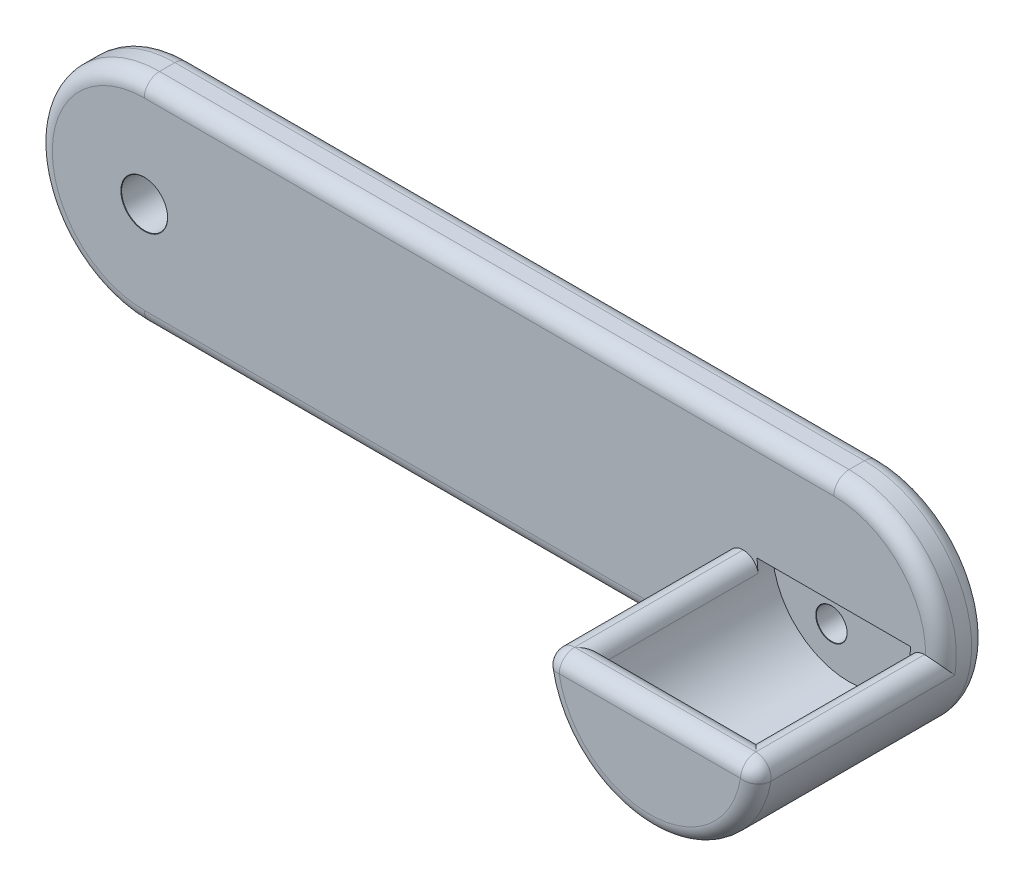
ISO-10303-21;
HEADER;
FILE_DESCRIPTION(('STEP AP214'),'2;1');
FILE_NAME('part.step','',(''),(''),'','','');
FILE_SCHEMA(('AUTOMOTIVE_DESIGN { 1 0 10303 214 1 1 1 1 }'));
ENDSEC;
DATA;
#1=APPLICATION_CONTEXT('core data for automotive mechanical design processes');
#2=APPLICATION_PROTOCOL_DEFINITION('international standard','automotive_design',2000,#1);
#3=PRODUCT_CONTEXT('',#1,'mechanical');
#4=PRODUCT('Part','Part','',(#3));
#5=PRODUCT_RELATED_PRODUCT_CATEGORY('part','',(#4));
#6=PRODUCT_DEFINITION_FORMATION('','',#4);
#7=PRODUCT_DEFINITION_CONTEXT('part definition',#1,'design');
#8=PRODUCT_DEFINITION('design','',#6,#7);
#9=PRODUCT_DEFINITION_SHAPE('','',#8);
#10=(LENGTH_UNIT() NAMED_UNIT(*) SI_UNIT(.MILLI.,.METRE.));
#11=(NAMED_UNIT(*) PLANE_ANGLE_UNIT() SI_UNIT($,.RADIAN.));
#12=(NAMED_UNIT(*) SI_UNIT($,.STERADIAN.) SOLID_ANGLE_UNIT());
#13=UNCERTAINTY_MEASURE_WITH_UNIT(LENGTH_MEASURE(1.E-05),#10,'distance_accuracy_value','');
#14=(GEOMETRIC_REPRESENTATION_CONTEXT(3) GLOBAL_UNCERTAINTY_ASSIGNED_CONTEXT((#13)) GLOBAL_UNIT_ASSIGNED_CONTEXT((#10,
#11,#12)) REPRESENTATION_CONTEXT('',''));
#15=CARTESIAN_POINT('',(0.,0.,0.));
#16=DIRECTION('',(0.,0.,1.));
#17=DIRECTION('',(1.,0.,0.));
#18=AXIS2_PLACEMENT_3D('',#15,#16,#17);
#19=CARTESIAN_POINT('',(0.,0.,3.));
#20=DIRECTION('',(0.,0.,-1.));
#21=DIRECTION('',(-1.,0.,0.));
#22=AXIS2_PLACEMENT_3D('',#19,#20,#21);
#23=CYLINDRICAL_SURFACE('',#22,7.);
#24=DIRECTION('',(0.,0.,-1.));
#25=VECTOR('',#24,1.);
#26=CARTESIAN_POINT('',(0.,7.,3.));
#27=LINE('',#26,#25);
#28=CARTESIAN_POINT('',(0.,7.,2.));
#29=VERTEX_POINT('',#28);
#30=CARTESIAN_POINT('',(0.,7.,1.));
#31=VERTEX_POINT('',#30);
#32=EDGE_CURVE('E423',#29,#31,#27,.T.);
#33=ORIENTED_EDGE('',*,*,#32,.T.);
#34=CARTESIAN_POINT('',(0.,0.,1.));
#35=DIRECTION('',(0.,0.,1.));
#36=DIRECTION('',(1.,0.,0.));
#37=AXIS2_PLACEMENT_3D('',#34,#35,#36);
#38=CIRCLE('',#37,7.);
#39=CARTESIAN_POINT('',(0.,-7.,1.));
#40=VERTEX_POINT('',#39);
#41=EDGE_CURVE('E477',#31,#40,#38,.T.);
#42=ORIENTED_EDGE('',*,*,#41,.T.);
#43=DIRECTION('',(0.,0.,-1.));
#44=VECTOR('',#43,1.);
#45=CARTESIAN_POINT('',(0.,-7.,3.));
#46=LINE('',#45,#44);
#47=CARTESIAN_POINT('',(0.,-7.,2.));
#48=VERTEX_POINT('',#47);
#49=EDGE_CURVE('E435',#48,#40,#46,.T.);
#50=ORIENTED_EDGE('',*,*,#49,.F.);
#51=CARTESIAN_POINT('',(0.,0.,2.));
#52=DIRECTION('',(0.,0.,1.));
#53=DIRECTION('',(1.,0.,0.));
#54=AXIS2_PLACEMENT_3D('',#51,#52,#53);
#55=CIRCLE('',#54,7.);
#56=EDGE_CURVE('E474',#48,#29,#55,.F.);
#57=ORIENTED_EDGE('',*,*,#56,.T.);
#58=EDGE_LOOP('',(#33,#42,#50,#57));
#59=FACE_BOUND('',#58,.T.);
#60=ADVANCED_FACE('F39',(#59),#23,.T.);
#61=CARTESIAN_POINT('',(0.,-7.,3.));
#62=DIRECTION('',(0.,1.,0.));
#63=DIRECTION('',(0.,0.,1.));
#64=AXIS2_PLACEMENT_3D('',#61,#62,#63);
#65=PLANE('',#64);
#66=ORIENTED_EDGE('',*,*,#49,.T.);
#67=DIRECTION('',(1.,0.,0.));
#68=VECTOR('',#67,1.);
#69=CARTESIAN_POINT('',(0.,-7.,1.));
#70=LINE('',#69,#68);
#71=CARTESIAN_POINT('',(45.,-7.,1.));
#72=VERTEX_POINT('',#71);
#73=EDGE_CURVE('E471',#40,#72,#70,.T.);
#74=ORIENTED_EDGE('',*,*,#73,.T.);
#75=DIRECTION('',(0.,0.,-1.));
#76=VECTOR('',#75,1.);
#77=CARTESIAN_POINT('',(45.,-7.,3.));
#78=LINE('',#77,#76);
#79=CARTESIAN_POINT('',(45.,-7.,2.));
#80=VERTEX_POINT('',#79);
#81=EDGE_CURVE('E431',#80,#72,#78,.T.);
#82=ORIENTED_EDGE('',*,*,#81,.F.);
#83=DIRECTION('',(1.,0.,0.));
#84=VECTOR('',#83,1.);
#85=CARTESIAN_POINT('',(0.,-7.,2.));
#86=LINE('',#85,#84);
#87=EDGE_CURVE('E468',#80,#48,#86,.F.);
#88=ORIENTED_EDGE('',*,*,#87,.T.);
#89=EDGE_LOOP('',(#66,#74,#82,#88));
#90=FACE_BOUND('',#89,.T.);
#91=ADVANCED_FACE('F271',(#90),#65,.F.);
#92=CARTESIAN_POINT('',(45.,0.,3.));
#93=DIRECTION('',(0.,0.,-1.));
#94=DIRECTION('',(-1.,0.,0.));
#95=AXIS2_PLACEMENT_3D('',#92,#93,#94);
#96=CYLINDRICAL_SURFACE('',#95,7.);
#97=ORIENTED_EDGE('',*,*,#81,.T.);
#98=CARTESIAN_POINT('',(45.,0.,1.));
#99=DIRECTION('',(0.,0.,1.));
#100=DIRECTION('',(1.,0.,0.));
#101=AXIS2_PLACEMENT_3D('',#98,#99,#100);
#102=CIRCLE('',#101,7.);
#103=CARTESIAN_POINT('',(45.,7.,1.));
#104=VERTEX_POINT('',#103);
#105=EDGE_CURVE('E451',#72,#104,#102,.T.);
#106=ORIENTED_EDGE('',*,*,#105,.T.);
#107=DIRECTION('',(0.,0.,-1.));
#108=VECTOR('',#107,1.);
#109=CARTESIAN_POINT('',(45.,7.,3.));
#110=LINE('',#109,#108);
#111=CARTESIAN_POINT('',(45.,7.,2.));
#112=VERTEX_POINT('',#111);
#113=EDGE_CURVE('E427',#112,#104,#110,.T.);
#114=ORIENTED_EDGE('',*,*,#113,.F.);
#115=CARTESIAN_POINT('',(45.,0.,2.));
#116=DIRECTION('',(0.,0.,1.));
#117=DIRECTION('',(1.,0.,0.));
#118=AXIS2_PLACEMENT_3D('',#115,#116,#117);
#119=CIRCLE('',#118,7.);
#120=CARTESIAN_POINT('',(51.9020930802829,-1.16666666666667,2.));
#121=VERTEX_POINT('',#120);
#122=EDGE_CURVE('E448',#112,#121,#119,.F.);
#123=ORIENTED_EDGE('',*,*,#122,.T.);
#124=DIRECTION('',(0.,0.,-1.));
#125=VECTOR('',#124,1.);
#126=CARTESIAN_POINT('',(51.9020930802829,-1.16666666666667,3.));
#127=LINE('',#126,#125);
#128=CARTESIAN_POINT('',(51.9020930802829,-1.16666666666667,14.));
#129=VERTEX_POINT('',#128);
#130=EDGE_CURVE('E442',#121,#129,#127,.F.);
#131=ORIENTED_EDGE('',*,*,#130,.T.);
#132=CARTESIAN_POINT('',(45.,0.,14.));
#133=DIRECTION('',(0.,0.,-1.));
#134=DIRECTION('',(-1.,0.,0.));
#135=AXIS2_PLACEMENT_3D('',#132,#133,#134);
#136=CIRCLE('',#135,7.);
#137=CARTESIAN_POINT('',(38.0979069197171,-1.16666666666667,14.));
#138=VERTEX_POINT('',#137);
#139=EDGE_CURVE('E439',#129,#138,#136,.T.);
#140=ORIENTED_EDGE('',*,*,#139,.T.);
#141=DIRECTION('',(0.,0.,-1.));
#142=VECTOR('',#141,1.);
#143=CARTESIAN_POINT('',(38.0979069197171,-1.16666666666667,3.));
#144=LINE('',#143,#142);
#145=CARTESIAN_POINT('',(38.0979069197171,-1.16666666666667,3.));
#146=VERTEX_POINT('',#145);
#147=EDGE_CURVE('E445',#138,#146,#144,.T.);
#148=ORIENTED_EDGE('',*,*,#147,.T.);
#149=CARTESIAN_POINT('',(45.,0.,3.));
#150=DIRECTION('',(0.,0.,1.));
#151=DIRECTION('',(-1.,0.,0.));
#152=AXIS2_PLACEMENT_3D('',#149,#150,#151);
#153=CIRCLE('',#152,7.);
#154=CARTESIAN_POINT('',(41.394448724536,-6.,3.));
#155=VERTEX_POINT('',#154);
#156=EDGE_CURVE('E403',#146,#155,#153,.T.);
#157=ORIENTED_EDGE('',*,*,#156,.T.);
#158=CARTESIAN_POINT('',(41.394448724536,-6.,3.));
#159=CARTESIAN_POINT('',(41.4450582268438,-6.03041382753642,2.99999291230302));
#160=CARTESIAN_POINT('',(41.496037033125,-6.06017529147223,2.99861348163104));
#161=CARTESIAN_POINT('',(41.5986147008607,-6.11833715170324,2.99340391427645));
#162=CARTESIAN_POINT('',(41.6502132829137,-6.14673813449379,2.98957484402681));
#163=CARTESIAN_POINT('',(41.8055802187509,-6.22972265473014,2.97487517416688));
#164=CARTESIAN_POINT('',(41.9101619313692,-6.28223313790197,2.96078926199282));
#165=CARTESIAN_POINT('',(42.1203271140369,-6.38129477477754,2.92593562133298));
#166=CARTESIAN_POINT('',(42.225903170781,-6.42787385145519,2.90520095070246));
#167=CARTESIAN_POINT('',(42.4382615831537,-6.51542025173984,2.85837389390015));
#168=CARTESIAN_POINT('',(42.5450448307451,-6.55638308630496,2.83227726307972));
#169=CARTESIAN_POINT('',(42.8433780021751,-6.66259073906168,2.75375286992972));
#170=CARTESIAN_POINT('',(43.035901662057,-6.72176788527623,2.69669521887693));
#171=CARTESIAN_POINT('',(43.4225710412745,-6.82288362390491,2.57375813103314));
#172=CARTESIAN_POINT('',(43.6167177322626,-6.86481100323072,2.50787299276344));
#173=CARTESIAN_POINT('',(44.2010708063447,-6.96548017899727,2.30198851369229));
#174=CARTESIAN_POINT('',(44.5931882114787,-6.99910832303838,2.15376070220848));
#175=CARTESIAN_POINT('',(44.9895651844608,-6.99999416059354,2.0039439630882));
#176=CARTESIAN_POINT('',(44.9947826816277,-6.99999999336149,2.00197193398149));
#177=CARTESIAN_POINT('',(45.,-7.,2.));
#178=B_SPLINE_CURVE_WITH_KNOTS('',3,(#158,#159,#160,#161,#162,#163,#164,#165,#166,#167,#168,
#169,#170,#171,#172,#173,#174,#175,#176,#177),.UNSPECIFIED.,.F.,.F.,(4,2,2,2,2,2,2,2,2,4),(0.,
0.177083512310358,0.35408998499881,0.707258810861298,1.05869820978894,1.41041689543041,
2.03723640077628,2.66446272434067,3.91892182880159,3.93565503848337),.UNSPECIFIED.);
#179=EDGE_CURVE('E275',#155,#80,#178,.T.);
#180=ORIENTED_EDGE('',*,*,#179,.T.);
#181=EDGE_LOOP('',(#97,#106,#114,#123,#131,#140,#148,#157,#180));
#182=FACE_BOUND('',#181,.T.);
#183=ADVANCED_FACE('F266',(#182),#96,.T.);
#184=CARTESIAN_POINT('',(0.,7.,3.));
#185=DIRECTION('',(0.,-1.,0.));
#186=DIRECTION('',(0.,0.,-1.));
#187=AXIS2_PLACEMENT_3D('',#184,#185,#186);
#188=PLANE('',#187);
#189=ORIENTED_EDGE('',*,*,#113,.T.);
#190=DIRECTION('',(-1.,0.,0.));
#191=VECTOR('',#190,1.);
#192=CARTESIAN_POINT('',(0.,7.,1.));
#193=LINE('',#192,#191);
#194=EDGE_CURVE('E282',#104,#31,#193,.T.);
#195=ORIENTED_EDGE('',*,*,#194,.T.);
#196=ORIENTED_EDGE('',*,*,#32,.F.);
#197=DIRECTION('',(-1.,0.,0.));
#198=VECTOR('',#197,1.);
#199=CARTESIAN_POINT('',(45.,7.,2.));
#200=LINE('',#199,#198);
#201=EDGE_CURVE('E510',#29,#112,#200,.F.);
#202=ORIENTED_EDGE('',*,*,#201,.T.);
#203=EDGE_LOOP('',(#189,#195,#196,#202));
#204=FACE_BOUND('',#203,.T.);
#205=ADVANCED_FACE('F260',(#204),#188,.F.);
#206=CARTESIAN_POINT('',(0.,0.,3.));
#207=DIRECTION('',(0.,0.,1.));
#208=DIRECTION('',(1.,0.,0.));
#209=AXIS2_PLACEMENT_3D('',#206,#207,#208);
#210=PLANE('',#209);
#211=DIRECTION('',(-1.,0.,0.));
#212=VECTOR('',#211,1.);
#213=CARTESIAN_POINT('',(38.,0.,3.));
#214=LINE('',#213,#212);
#215=CARTESIAN_POINT('',(50.,0.,3.));
#216=VERTEX_POINT('',#215);
#217=CARTESIAN_POINT('',(40.,0.,3.));
#218=VERTEX_POINT('',#217);
#219=EDGE_CURVE('E407',#216,#218,#214,.T.);
#220=ORIENTED_EDGE('',*,*,#219,.F.);
#221=CARTESIAN_POINT('',(45.,0.,3.));
#222=DIRECTION('',(0.,0.,1.));
#223=DIRECTION('',(1.,0.,0.));
#224=AXIS2_PLACEMENT_3D('',#221,#222,#223);
#225=CIRCLE('',#224,5.);
#226=CARTESIAN_POINT('',(49.9300664859163,-0.833333333333334,3.));
#227=VERTEX_POINT('',#226);
#228=EDGE_CURVE('E504',#227,#216,#225,.T.);
#229=ORIENTED_EDGE('',*,*,#228,.F.);
#230=CARTESIAN_POINT('',(50.9160797830996,-1.,3.));
#231=DIRECTION('',(0.,0.,1.));
#232=DIRECTION('',(1.,0.,0.));
#233=AXIS2_PLACEMENT_3D('',#230,#231,#232);
#234=CIRCLE('',#233,1.);
#235=CARTESIAN_POINT('',(50.9160797830996,0.,3.));
#236=VERTEX_POINT('',#235);
#237=EDGE_CURVE('E50',#227,#236,#234,.F.);
#238=ORIENTED_EDGE('',*,*,#237,.T.);
#239=CARTESIAN_POINT('',(50.9160797830996,-1.,3.));
#240=DIRECTION('',(0.,0.,1.));
#241=DIRECTION('',(1.,0.,0.));
#242=AXIS2_PLACEMENT_3D('',#239,#240,#241);
#243=CIRCLE('',#242,1.);
#244=CARTESIAN_POINT('',(50.9999989630996,-0.00352743578701635,3.));
#245=VERTEX_POINT('',#244);
#246=EDGE_CURVE('E205',#236,#245,#243,.F.);
#247=ORIENTED_EDGE('',*,*,#246,.T.);
#248=CARTESIAN_POINT('',(45.,0.,3.));
#249=DIRECTION('',(0.,0.,1.));
#250=DIRECTION('',(1.,0.,0.));
#251=AXIS2_PLACEMENT_3D('',#248,#249,#250);
#252=CIRCLE('',#251,6.);
#253=CARTESIAN_POINT('',(45.,6.,3.));
#254=VERTEX_POINT('',#253);
#255=EDGE_CURVE('E489',#245,#254,#252,.T.);
#256=ORIENTED_EDGE('',*,*,#255,.T.);
#257=DIRECTION('',(-1.,0.,0.));
#258=VECTOR('',#257,1.);
#259=CARTESIAN_POINT('',(0.,6.,3.));
#260=LINE('',#259,#258);
#261=CARTESIAN_POINT('',(0.,6.,3.));
#262=VERTEX_POINT('',#261);
#263=EDGE_CURVE('E480',#254,#262,#260,.T.);
#264=ORIENTED_EDGE('',*,*,#263,.T.);
#265=CARTESIAN_POINT('',(0.,0.,3.));
#266=DIRECTION('',(0.,0.,1.));
#267=DIRECTION('',(1.,0.,0.));
#268=AXIS2_PLACEMENT_3D('',#265,#266,#267);
#269=CIRCLE('',#268,6.);
#270=CARTESIAN_POINT('',(0.,-6.,3.));
#271=VERTEX_POINT('',#270);
#272=EDGE_CURVE('E483',#262,#271,#269,.T.);
#273=ORIENTED_EDGE('',*,*,#272,.T.);
#274=DIRECTION('',(1.,0.,0.));
#275=VECTOR('',#274,1.);
#276=CARTESIAN_POINT('',(45.,-6.,3.));
#277=LINE('',#276,#275);
#278=EDGE_CURVE('E486',#271,#155,#277,.T.);
#279=ORIENTED_EDGE('',*,*,#278,.T.);
#280=ORIENTED_EDGE('',*,*,#156,.F.);
#281=CARTESIAN_POINT('',(39.0839202169004,-1.,3.));
#282=DIRECTION('',(0.,0.,1.));
#283=DIRECTION('',(1.,0.,0.));
#284=AXIS2_PLACEMENT_3D('',#281,#282,#283);
#285=CIRCLE('',#284,1.);
#286=CARTESIAN_POINT('',(39.0839202169004,0.,3.));
#287=VERTEX_POINT('',#286);
#288=EDGE_CURVE('E211',#146,#287,#285,.F.);
#289=ORIENTED_EDGE('',*,*,#288,.T.);
#290=CARTESIAN_POINT('',(39.0839202169004,-1.,3.));
#291=DIRECTION('',(0.,0.,1.));
#292=DIRECTION('',(1.,0.,0.));
#293=AXIS2_PLACEMENT_3D('',#290,#291,#292);
#294=CIRCLE('',#293,1.);
#295=CARTESIAN_POINT('',(40.0699335140837,-0.833333333333334,3.));
#296=VERTEX_POINT('',#295);
#297=EDGE_CURVE('E11',#287,#296,#294,.F.);
#298=ORIENTED_EDGE('',*,*,#297,.T.);
#299=CARTESIAN_POINT('',(45.,0.,3.));
#300=DIRECTION('',(0.,0.,1.));
#301=DIRECTION('',(1.,0.,0.));
#302=AXIS2_PLACEMENT_3D('',#299,#300,#301);
#303=CIRCLE('',#302,5.);
#304=EDGE_CURVE('E58',#218,#296,#303,.T.);
#305=ORIENTED_EDGE('',*,*,#304,.F.);
#306=EDGE_LOOP('',(#220,#229,#238,#247,#256,#264,#273,#279,#280,#289,#298,#305));
#307=FACE_BOUND('',#306,.T.);
#308=CARTESIAN_POINT('',(0.,0.,3.));
#309=DIRECTION('',(0.,0.,1.));
#310=DIRECTION('',(1.,0.,0.));
#311=AXIS2_PLACEMENT_3D('',#308,#309,#310);
#312=CIRCLE('',#311,1.525);
#313=CARTESIAN_POINT('',(1.525,0.,3.));
#314=VERTEX_POINT('',#313);
#315=EDGE_CURVE('E411',#314,#314,#312,.T.);
#316=ORIENTED_EDGE('',*,*,#315,.F.);
#317=EDGE_LOOP('',(#316));
#318=FACE_BOUND('',#317,.T.);
#319=ADVANCED_FACE('F257',(#307,#318),#210,.T.);
#320=CARTESIAN_POINT('',(0.,0.,0.));
#321=DIRECTION('',(0.,0.,1.));
#322=DIRECTION('',(1.,0.,0.));
#323=AXIS2_PLACEMENT_3D('',#320,#321,#322);
#324=PLANE('',#323);
#325=CARTESIAN_POINT('',(43.846220674105,-2.3,0.));
#326=DIRECTION('',(0.,0.,1.));
#327=DIRECTION('',(1.,0.,0.));
#328=AXIS2_PLACEMENT_3D('',#325,#326,#327);
#329=CIRCLE('',#328,1.);
#330=CARTESIAN_POINT('',(44.846220674105,-2.3,0.));
#331=VERTEX_POINT('',#330);
#332=EDGE_CURVE('E786',#331,#331,#329,.T.);
#333=ORIENTED_EDGE('',*,*,#332,.T.);
#334=EDGE_LOOP('',(#333));
#335=FACE_BOUND('',#334,.T.);
#336=DIRECTION('',(-1.,0.,0.));
#337=VECTOR('',#336,1.);
#338=CARTESIAN_POINT('',(0.,6.,0.));
#339=LINE('',#338,#337);
#340=CARTESIAN_POINT('',(0.,6.,0.));
#341=VERTEX_POINT('',#340);
#342=CARTESIAN_POINT('',(45.,6.,0.));
#343=VERTEX_POINT('',#342);
#344=EDGE_CURVE('E455',#341,#343,#339,.F.);
#345=ORIENTED_EDGE('',*,*,#344,.T.);
#346=CARTESIAN_POINT('',(45.,0.,0.));
#347=DIRECTION('',(0.,0.,1.));
#348=DIRECTION('',(1.,0.,0.));
#349=AXIS2_PLACEMENT_3D('',#346,#347,#348);
#350=CIRCLE('',#349,6.);
#351=CARTESIAN_POINT('',(45.,-6.,0.));
#352=VERTEX_POINT('',#351);
#353=EDGE_CURVE('E464',#343,#352,#350,.F.);
#354=ORIENTED_EDGE('',*,*,#353,.T.);
#355=DIRECTION('',(1.,0.,0.));
#356=VECTOR('',#355,1.);
#357=CARTESIAN_POINT('',(0.,-6.,0.));
#358=LINE('',#357,#356);
#359=CARTESIAN_POINT('',(0.,-6.,0.));
#360=VERTEX_POINT('',#359);
#361=EDGE_CURVE('E461',#352,#360,#358,.F.);
#362=ORIENTED_EDGE('',*,*,#361,.T.);
#363=CARTESIAN_POINT('',(0.,0.,0.));
#364=DIRECTION('',(0.,0.,1.));
#365=DIRECTION('',(1.,0.,0.));
#366=AXIS2_PLACEMENT_3D('',#363,#364,#365);
#367=CIRCLE('',#366,6.);
#368=EDGE_CURVE('E458',#360,#341,#367,.F.);
#369=ORIENTED_EDGE('',*,*,#368,.T.);
#370=EDGE_LOOP('',(#345,#354,#362,#369));
#371=FACE_BOUND('',#370,.T.);
#372=CARTESIAN_POINT('',(0.,0.,0.));
#373=DIRECTION('',(0.,0.,1.));
#374=DIRECTION('',(1.,0.,0.));
#375=AXIS2_PLACEMENT_3D('',#372,#373,#374);
#376=CIRCLE('',#375,1.5);
#377=CARTESIAN_POINT('',(1.5,0.,0.));
#378=VERTEX_POINT('',#377);
#379=EDGE_CURVE('E419',#378,#378,#376,.T.);
#380=ORIENTED_EDGE('',*,*,#379,.T.);
#381=EDGE_LOOP('',(#380));
#382=FACE_BOUND('',#381,.T.);
#383=ADVANCED_FACE('F255',(#335,#371,#382),#324,.F.);
#384=CARTESIAN_POINT('',(0.,0.,3.));
#385=DIRECTION('',(0.,0.,1.));
#386=DIRECTION('',(1.,0.,0.));
#387=AXIS2_PLACEMENT_3D('',#384,#385,#386);
#388=CYLINDRICAL_SURFACE('',#387,1.5);
#389=ORIENTED_EDGE('',*,*,#379,.F.);
#390=EDGE_LOOP('',(#389));
#391=FACE_BOUND('',#390,.T.);
#392=CARTESIAN_POINT('',(0.,0.,2.97902250922057));
#393=DIRECTION('',(0.,0.,1.));
#394=DIRECTION('',(1.,0.,0.));
#395=AXIS2_PLACEMENT_3D('',#392,#393,#394);
#396=CIRCLE('',#395,1.5);
#397=CARTESIAN_POINT('',(1.5,0.,2.97902250922057));
#398=VERTEX_POINT('',#397);
#399=EDGE_CURVE('E415',#398,#398,#396,.T.);
#400=ORIENTED_EDGE('',*,*,#399,.T.);
#401=EDGE_LOOP('',(#400));
#402=FACE_BOUND('',#401,.T.);
#403=ADVANCED_FACE('F251',(#391,#402),#388,.F.);
#404=CARTESIAN_POINT('',(0.,0.,3.));
#405=DIRECTION('',(0.,0.,1.));
#406=DIRECTION('',(1.,0.,0.));
#407=AXIS2_PLACEMENT_3D('',#404,#405,#406);
#408=CONICAL_SURFACE('',#407,1.525,0.872664625997208);
#409=ORIENTED_EDGE('',*,*,#399,.F.);
#410=EDGE_LOOP('',(#409));
#411=FACE_BOUND('',#410,.T.);
#412=ORIENTED_EDGE('',*,*,#315,.T.);
#413=EDGE_LOOP('',(#412));
#414=FACE_BOUND('',#413,.T.);
#415=ADVANCED_FACE('F247',(#411,#414),#408,.F.);
#416=CARTESIAN_POINT('',(45.,0.,15.));
#417=DIRECTION('',(0.,0.,-1.));
#418=DIRECTION('',(-1.,0.,0.));
#419=AXIS2_PLACEMENT_3D('',#416,#417,#418);
#420=PLANE('',#419);
#421=DIRECTION('',(-1.,0.,0.));
#422=VECTOR('',#421,1.);
#423=CARTESIAN_POINT('',(45.,-1.,15.));
#424=LINE('',#423,#422);
#425=CARTESIAN_POINT('',(50.9160797830996,-1.,15.));
#426=VERTEX_POINT('',#425);
#427=CARTESIAN_POINT('',(39.0839202169004,-1.,15.));
#428=VERTEX_POINT('',#427);
#429=EDGE_CURVE('E493',#426,#428,#424,.T.);
#430=ORIENTED_EDGE('',*,*,#429,.T.);
#431=CARTESIAN_POINT('',(45.,0.,15.));
#432=DIRECTION('',(0.,0.,-1.));
#433=DIRECTION('',(-1.,0.,0.));
#434=AXIS2_PLACEMENT_3D('',#431,#432,#433);
#435=CIRCLE('',#434,6.);
#436=EDGE_CURVE('E496',#428,#426,#435,.F.);
#437=ORIENTED_EDGE('',*,*,#436,.T.);
#438=EDGE_LOOP('',(#430,#437));
#439=FACE_BOUND('',#438,.T.);
#440=ADVANCED_FACE('F244',(#439),#420,.F.);
#441=CARTESIAN_POINT('',(38.,0.,15.));
#442=DIRECTION('',(0.,-1.,0.));
#443=DIRECTION('',(0.,0.,-1.));
#444=AXIS2_PLACEMENT_3D('',#441,#442,#443);
#445=PLANE('',#444);
#446=ORIENTED_EDGE('',*,*,#219,.T.);
#447=DIRECTION('',(0.,0.,-1.));
#448=VECTOR('',#447,1.);
#449=CARTESIAN_POINT('',(40.,0.,13.));
#450=LINE('',#449,#448);
#451=CARTESIAN_POINT('',(40.,0.,2.));
#452=VERTEX_POINT('',#451);
#453=EDGE_CURVE('E389',#218,#452,#450,.T.);
#454=ORIENTED_EDGE('',*,*,#453,.T.);
#455=DIRECTION('',(-1.,0.,0.));
#456=VECTOR('',#455,1.);
#457=CARTESIAN_POINT('',(38.,0.,2.));
#458=LINE('',#457,#456);
#459=CARTESIAN_POINT('',(50.,0.,2.));
#460=VERTEX_POINT('',#459);
#461=EDGE_CURVE('E399',#460,#452,#458,.T.);
#462=ORIENTED_EDGE('',*,*,#461,.F.);
#463=DIRECTION('',(0.,0.,-1.));
#464=VECTOR('',#463,1.);
#465=CARTESIAN_POINT('',(50.,0.,13.));
#466=LINE('',#465,#464);
#467=EDGE_CURVE('E86',#216,#460,#466,.T.);
#468=ORIENTED_EDGE('',*,*,#467,.F.);
#469=EDGE_LOOP('',(#446,#454,#462,#468));
#470=FACE_BOUND('',#469,.T.);
#471=ADVANCED_FACE('F233',(#470),#445,.T.);
#472=CARTESIAN_POINT('',(45.,0.,3.));
#473=DIRECTION('',(0.,0.,-1.));
#474=DIRECTION('',(-1.,0.,0.));
#475=AXIS2_PLACEMENT_3D('',#472,#473,#474);
#476=CYLINDRICAL_SURFACE('',#475,5.);
#477=CARTESIAN_POINT('',(49.8989794855654,-1.,13.));
#478=CARTESIAN_POINT('',(49.9046669473129,-0.972120712889401,12.9999962269156));
#479=CARTESIAN_POINT('',(49.9101012615493,-0.944292180445064,13.0011598989415));
#480=CARTESIAN_POINT('',(49.9204635949996,-0.888736624889511,13.0058221332137));
#481=CARTESIAN_POINT('',(49.9253916142135,-0.861009601778293,13.00932069546));
#482=CARTESIAN_POINT('',(49.9300664859163,-0.833333333333334,13.0139867028165));
#483=B_SPLINE_CURVE_WITH_KNOTS('',3,(#477,#478,#479,#480,#481,#482),.UNSPECIFIED.,.F.,.F.,(4,2,
4),(0.,0.0851341182856824,0.170268236569527),.UNSPECIFIED.);
#484=CARTESIAN_POINT('',(49.8989794855664,-1.,13.));
#485=VERTEX_POINT('',#484);
#486=CARTESIAN_POINT('',(49.9300664859163,-0.833333333333334,13.0139867028166));
#487=VERTEX_POINT('',#486);
#488=EDGE_CURVE('E204',#485,#487,#483,.T.);
#489=ORIENTED_EDGE('',*,*,#488,.T.);
#490=DIRECTION('',(0.,0.,-1.));
#491=VECTOR('',#490,1.);
#492=CARTESIAN_POINT('',(49.9300664859163,-0.833333333333334,3.));
#493=LINE('',#492,#491);
#494=EDGE_CURVE('E507',#487,#227,#493,.T.);
#495=ORIENTED_EDGE('',*,*,#494,.T.);
#496=ORIENTED_EDGE('',*,*,#228,.T.);
#497=ORIENTED_EDGE('',*,*,#467,.T.);
#498=CARTESIAN_POINT('',(45.,0.,2.));
#499=DIRECTION('',(0.,0.,1.));
#500=DIRECTION('',(1.,0.,0.));
#501=AXIS2_PLACEMENT_3D('',#498,#499,#500);
#502=CIRCLE('',#501,5.);
#503=EDGE_CURVE('E395',#452,#460,#502,.T.);
#504=ORIENTED_EDGE('',*,*,#503,.F.);
#505=ORIENTED_EDGE('',*,*,#453,.F.);
#506=ORIENTED_EDGE('',*,*,#304,.T.);
#507=DIRECTION('',(0.,0.,-1.));
#508=VECTOR('',#507,1.);
#509=CARTESIAN_POINT('',(40.0699335140837,-0.833333333333334,3.));
#510=LINE('',#509,#508);
#511=CARTESIAN_POINT('',(40.0699335140837,-0.833333333333334,13.0139867028166));
#512=VERTEX_POINT('',#511);
#513=EDGE_CURVE('E180',#296,#512,#510,.F.);
#514=ORIENTED_EDGE('',*,*,#513,.T.);
#515=CARTESIAN_POINT('',(40.0699335140837,-0.833333333333334,13.0139867028166));
#516=CARTESIAN_POINT('',(40.0746083857866,-0.861009601778228,13.0093206954601));
#517=CARTESIAN_POINT('',(40.0795364050006,-0.888736624889415,13.0058221332138));
#518=CARTESIAN_POINT('',(40.0898987384505,-0.944292180444968,13.0011598989415));
#519=CARTESIAN_POINT('',(40.0953330526866,-0.972120712889336,12.9999962269156));
#520=CARTESIAN_POINT('',(40.1010205144336,-0.999999999999999,13.));
#521=B_SPLINE_CURVE_WITH_KNOTS('',3,(#515,#516,#517,#518,#519,#520),.UNSPECIFIED.,.F.,.F.,(4,2,
4),(0.,0.0851341182837668,0.170268236569357),.UNSPECIFIED.);
#522=CARTESIAN_POINT('',(40.1010205144336,-1.,13.));
#523=VERTEX_POINT('',#522);
#524=EDGE_CURVE('E186',#512,#523,#521,.T.);
#525=ORIENTED_EDGE('',*,*,#524,.T.);
#526=CARTESIAN_POINT('',(45.,0.,13.));
#527=DIRECTION('',(0.,0.,-1.));
#528=DIRECTION('',(-1.,0.,0.));
#529=AXIS2_PLACEMENT_3D('',#526,#527,#528);
#530=CIRCLE('',#529,5.);
#531=EDGE_CURVE('E383',#523,#485,#530,.F.);
#532=ORIENTED_EDGE('',*,*,#531,.T.);
#533=EDGE_LOOP('',(#489,#495,#496,#497,#504,#505,#506,#514,#525,#532));
#534=FACE_BOUND('',#533,.T.);
#535=ADVANCED_FACE('F183',(#534),#476,.F.);
#536=CARTESIAN_POINT('',(0.,0.,2.));
#537=DIRECTION('',(0.,0.,1.));
#538=DIRECTION('',(1.,0.,0.));
#539=AXIS2_PLACEMENT_3D('',#536,#537,#538);
#540=PLANE('',#539);
#541=CARTESIAN_POINT('',(43.846220674105,-2.3,2.));
#542=DIRECTION('',(0.,0.,1.));
#543=DIRECTION('',(1.,0.,0.));
#544=AXIS2_PLACEMENT_3D('',#541,#542,#543);
#545=CIRCLE('',#544,1.025);
#546=CARTESIAN_POINT('',(44.871220674105,-2.3,2.));
#547=VERTEX_POINT('',#546);
#548=EDGE_CURVE('E782',#547,#547,#545,.T.);
#549=ORIENTED_EDGE('',*,*,#548,.F.);
#550=EDGE_LOOP('',(#549));
#551=FACE_BOUND('',#550,.T.);
#552=ORIENTED_EDGE('',*,*,#503,.T.);
#553=ORIENTED_EDGE('',*,*,#461,.T.);
#554=EDGE_LOOP('',(#552,#553));
#555=FACE_BOUND('',#554,.T.);
#556=ADVANCED_FACE('F232',(#551,#555),#540,.T.);
#557=CARTESIAN_POINT('',(45.,0.,13.));
#558=DIRECTION('',(0.,0.,-1.));
#559=DIRECTION('',(-1.,0.,0.));
#560=AXIS2_PLACEMENT_3D('',#557,#558,#559);
#561=PLANE('',#560);
#562=ORIENTED_EDGE('',*,*,#531,.F.);
#563=DIRECTION('',(-1.,0.,0.));
#564=VECTOR('',#563,1.);
#565=CARTESIAN_POINT('',(50.,-1.,13.));
#566=LINE('',#565,#564);
#567=EDGE_CURVE('E191',#523,#485,#566,.F.);
#568=ORIENTED_EDGE('',*,*,#567,.T.);
#569=EDGE_LOOP('',(#562,#568));
#570=FACE_BOUND('',#569,.T.);
#571=ADVANCED_FACE('F238',(#570),#561,.T.);
#572=CARTESIAN_POINT('',(0.,0.,1.));
#573=DIRECTION('',(0.,0.,1.));
#574=DIRECTION('',(1.,0.,0.));
#575=AXIS2_PLACEMENT_3D('',#572,#573,#574);
#576=TOROIDAL_SURFACE('',#575,6.,1.);
#577=CARTESIAN_POINT('',(0.,6.,1.));
#578=DIRECTION('',(1.,0.,0.));
#579=DIRECTION('',(0.,0.,-1.));
#580=AXIS2_PLACEMENT_3D('',#577,#578,#579);
#581=CIRCLE('',#580,1.);
#582=EDGE_CURVE('E375',#341,#31,#581,.T.);
#583=ORIENTED_EDGE('',*,*,#582,.F.);
#584=ORIENTED_EDGE('',*,*,#368,.F.);
#585=CARTESIAN_POINT('',(0.,-6.,1.));
#586=DIRECTION('',(1.,0.,0.));
#587=DIRECTION('',(0.,0.,-1.));
#588=AXIS2_PLACEMENT_3D('',#585,#586,#587);
#589=CIRCLE('',#588,1.);
#590=EDGE_CURVE('E380',#40,#360,#589,.T.);
#591=ORIENTED_EDGE('',*,*,#590,.F.);
#592=ORIENTED_EDGE('',*,*,#41,.F.);
#593=EDGE_LOOP('',(#583,#584,#591,#592));
#594=FACE_BOUND('',#593,.T.);
#595=ADVANCED_FACE('F242',(#594),#576,.T.);
#596=CARTESIAN_POINT('',(0.,-6.,1.));
#597=DIRECTION('',(1.,0.,0.));
#598=DIRECTION('',(0.,0.,-1.));
#599=AXIS2_PLACEMENT_3D('',#596,#597,#598);
#600=CYLINDRICAL_SURFACE('',#599,1.);
#601=ORIENTED_EDGE('',*,*,#590,.T.);
#602=ORIENTED_EDGE('',*,*,#361,.F.);
#603=CARTESIAN_POINT('',(45.,-6.,1.));
#604=DIRECTION('',(1.,0.,0.));
#605=DIRECTION('',(0.,0.,-1.));
#606=AXIS2_PLACEMENT_3D('',#603,#604,#605);
#607=CIRCLE('',#606,1.);
#608=EDGE_CURVE('E367',#72,#352,#607,.T.);
#609=ORIENTED_EDGE('',*,*,#608,.F.);
#610=ORIENTED_EDGE('',*,*,#73,.F.);
#611=EDGE_LOOP('',(#601,#602,#609,#610));
#612=FACE_BOUND('',#611,.T.);
#613=ADVANCED_FACE('F531',(#612),#600,.T.);
#614=CARTESIAN_POINT('',(0.,6.,1.));
#615=DIRECTION('',(-1.,0.,0.));
#616=DIRECTION('',(0.,0.,1.));
#617=AXIS2_PLACEMENT_3D('',#614,#615,#616);
#618=CYLINDRICAL_SURFACE('',#617,1.);
#619=ORIENTED_EDGE('',*,*,#582,.T.);
#620=ORIENTED_EDGE('',*,*,#194,.F.);
#621=CARTESIAN_POINT('',(45.,6.,1.));
#622=DIRECTION('',(1.,0.,0.));
#623=DIRECTION('',(0.,0.,-1.));
#624=AXIS2_PLACEMENT_3D('',#621,#622,#623);
#625=CIRCLE('',#624,1.);
#626=EDGE_CURVE('E363',#343,#104,#625,.T.);
#627=ORIENTED_EDGE('',*,*,#626,.F.);
#628=ORIENTED_EDGE('',*,*,#344,.F.);
#629=EDGE_LOOP('',(#619,#620,#627,#628));
#630=FACE_BOUND('',#629,.T.);
#631=ADVANCED_FACE('F526',(#630),#618,.T.);
#632=CARTESIAN_POINT('',(45.,0.,1.));
#633=DIRECTION('',(0.,0.,1.));
#634=DIRECTION('',(1.,0.,0.));
#635=AXIS2_PLACEMENT_3D('',#632,#633,#634);
#636=TOROIDAL_SURFACE('',#635,6.,1.);
#637=ORIENTED_EDGE('',*,*,#608,.T.);
#638=ORIENTED_EDGE('',*,*,#353,.F.);
#639=ORIENTED_EDGE('',*,*,#626,.T.);
#640=ORIENTED_EDGE('',*,*,#105,.F.);
#641=EDGE_LOOP('',(#637,#638,#639,#640));
#642=FACE_BOUND('',#641,.T.);
#643=ADVANCED_FACE('F529',(#642),#636,.T.);
#644=CARTESIAN_POINT('',(39.0839202169004,-1.,3.));
#645=DIRECTION('',(0.,0.,-1.));
#646=DIRECTION('',(-1.,0.,0.));
#647=AXIS2_PLACEMENT_3D('',#644,#645,#646);
#648=CYLINDRICAL_SURFACE('',#647,1.);
#649=CARTESIAN_POINT('',(39.0839202169004,-1.,14.));
#650=DIRECTION('',(0.,0.,1.));
#651=DIRECTION('',(1.,0.,0.));
#652=AXIS2_PLACEMENT_3D('',#649,#650,#651);
#653=CIRCLE('',#652,1.);
#654=CARTESIAN_POINT('',(39.0839202169004,0.,14.));
#655=VERTEX_POINT('',#654);
#656=EDGE_CURVE('E43',#655,#138,#653,.T.);
#657=ORIENTED_EDGE('',*,*,#656,.F.);
#658=DIRECTION('',(0.,0.,-1.));
#659=VECTOR('',#658,1.);
#660=CARTESIAN_POINT('',(39.0839202169004,0.,15.));
#661=LINE('',#660,#659);
#662=EDGE_CURVE('E195',#287,#655,#661,.F.);
#663=ORIENTED_EDGE('',*,*,#662,.F.);
#664=ORIENTED_EDGE('',*,*,#288,.F.);
#665=ORIENTED_EDGE('',*,*,#147,.F.);
#666=EDGE_LOOP('',(#657,#663,#664,#665));
#667=FACE_BOUND('',#666,.T.);
#668=ADVANCED_FACE('F41',(#667),#648,.T.);
#669=CARTESIAN_POINT('',(39.0839202169004,-1.,14.));
#670=DIRECTION('',(0.,0.,1.));
#671=DIRECTION('',(1.,0.,0.));
#672=AXIS2_PLACEMENT_3D('',#669,#670,#671);
#673=SPHERICAL_SURFACE('',#672,1.);
#674=CARTESIAN_POINT('',(39.0839202169004,-1.,14.));
#675=DIRECTION('',(-1.,0.,0.));
#676=DIRECTION('',(0.,0.,1.));
#677=AXIS2_PLACEMENT_3D('',#674,#675,#676);
#678=CIRCLE('',#677,1.);
#679=EDGE_CURVE('E354',#655,#428,#678,.F.);
#680=ORIENTED_EDGE('',*,*,#679,.F.);
#681=ORIENTED_EDGE('',*,*,#656,.T.);
#682=CARTESIAN_POINT('',(39.0839202169004,-0.999999999999999,14.));
#683=DIRECTION('',(-0.166666666666666,0.986013297183269,0.));
#684=DIRECTION('',(-0.986013297183269,-0.166666666666666,0.));
#685=AXIS2_PLACEMENT_3D('',#682,#683,#684);
#686=CIRCLE('',#685,1.);
#687=EDGE_CURVE('E358',#428,#138,#686,.F.);
#688=ORIENTED_EDGE('',*,*,#687,.F.);
#689=EDGE_LOOP('',(#680,#681,#688));
#690=FACE_BOUND('',#689,.T.);
#691=ADVANCED_FACE('F549',(#690),#673,.T.);
#692=CARTESIAN_POINT('',(39.0839202169004,-1.,3.));
#693=DIRECTION('',(0.,0.,-1.));
#694=DIRECTION('',(-1.,0.,0.));
#695=AXIS2_PLACEMENT_3D('',#692,#693,#694);
#696=CYLINDRICAL_SURFACE('',#695,1.);
#697=ORIENTED_EDGE('',*,*,#297,.F.);
#698=ORIENTED_EDGE('',*,*,#662,.T.);
#699=CARTESIAN_POINT('',(39.0839202169004,-1.,14.));
#700=DIRECTION('',(0.707106781186547,0.,0.707106781186547));
#701=DIRECTION('',(0.707106781186547,0.,-0.707106781186547));
#702=AXIS2_PLACEMENT_3D('',#699,#700,#701);
#703=ELLIPSE('',#702,1.41421356237309,1.);
#704=EDGE_CURVE('E193',#512,#655,#703,.T.);
#705=ORIENTED_EDGE('',*,*,#704,.F.);
#706=ORIENTED_EDGE('',*,*,#513,.F.);
#707=EDGE_LOOP('',(#697,#698,#705,#706));
#708=FACE_BOUND('',#707,.T.);
#709=ADVANCED_FACE('F194',(#708),#696,.T.);
#710=CARTESIAN_POINT('',(45.,0.,14.));
#711=DIRECTION('',(0.,0.,-1.));
#712=DIRECTION('',(-1.,0.,0.));
#713=AXIS2_PLACEMENT_3D('',#710,#711,#712);
#714=TOROIDAL_SURFACE('',#713,6.,1.);
#715=ORIENTED_EDGE('',*,*,#687,.T.);
#716=ORIENTED_EDGE('',*,*,#139,.F.);
#717=CARTESIAN_POINT('',(50.9160797830996,-1.,14.));
#718=DIRECTION('',(0.166666666666667,0.986013297183269,0.));
#719=DIRECTION('',(-0.986013297183269,0.166666666666667,0.));
#720=AXIS2_PLACEMENT_3D('',#717,#718,#719);
#721=CIRCLE('',#720,1.);
#722=EDGE_CURVE('E198',#426,#129,#721,.T.);
#723=ORIENTED_EDGE('',*,*,#722,.F.);
#724=ORIENTED_EDGE('',*,*,#436,.F.);
#725=EDGE_LOOP('',(#715,#716,#723,#724));
#726=FACE_BOUND('',#725,.T.);
#727=ADVANCED_FACE('F556',(#726),#714,.T.);
#728=CARTESIAN_POINT('',(45.,-1.,14.));
#729=DIRECTION('',(-1.,0.,0.));
#730=DIRECTION('',(0.,0.,1.));
#731=AXIS2_PLACEMENT_3D('',#728,#729,#730);
#732=CYLINDRICAL_SURFACE('',#731,1.);
#733=DIRECTION('',(-1.,0.,0.));
#734=VECTOR('',#733,1.);
#735=CARTESIAN_POINT('',(38.,0.,14.));
#736=LINE('',#735,#734);
#737=CARTESIAN_POINT('',(50.9160797830996,0.,14.));
#738=VERTEX_POINT('',#737);
#739=EDGE_CURVE('E70',#655,#738,#736,.F.);
#740=ORIENTED_EDGE('',*,*,#739,.F.);
#741=ORIENTED_EDGE('',*,*,#679,.T.);
#742=ORIENTED_EDGE('',*,*,#429,.F.);
#743=CARTESIAN_POINT('',(50.9160797830996,-1.,14.));
#744=DIRECTION('',(1.,0.,0.));
#745=DIRECTION('',(0.,0.,-1.));
#746=AXIS2_PLACEMENT_3D('',#743,#744,#745);
#747=CIRCLE('',#746,1.);
#748=EDGE_CURVE('E346',#738,#426,#747,.T.);
#749=ORIENTED_EDGE('',*,*,#748,.F.);
#750=EDGE_LOOP('',(#740,#741,#742,#749));
#751=FACE_BOUND('',#750,.T.);
#752=ADVANCED_FACE('F560',(#751),#732,.T.);
#753=CARTESIAN_POINT('',(38.,-1.,14.));
#754=DIRECTION('',(1.,0.,0.));
#755=DIRECTION('',(0.,0.,-1.));
#756=AXIS2_PLACEMENT_3D('',#753,#754,#755);
#757=CYLINDRICAL_SURFACE('',#756,1.);
#758=ORIENTED_EDGE('',*,*,#704,.T.);
#759=ORIENTED_EDGE('',*,*,#739,.T.);
#760=CARTESIAN_POINT('',(50.9160797830996,-1.,14.));
#761=DIRECTION('',(0.707106781186547,0.,-0.707106781186547));
#762=DIRECTION('',(0.707106781186547,0.,0.707106781186547));
#763=AXIS2_PLACEMENT_3D('',#760,#761,#762);
#764=ELLIPSE('',#763,1.41421356237309,1.);
#765=EDGE_CURVE('E342',#487,#738,#764,.T.);
#766=ORIENTED_EDGE('',*,*,#765,.F.);
#767=ORIENTED_EDGE('',*,*,#488,.F.);
#768=ORIENTED_EDGE('',*,*,#567,.F.);
#769=ORIENTED_EDGE('',*,*,#524,.F.);
#770=EDGE_LOOP('',(#758,#759,#766,#767,#768,#769));
#771=FACE_BOUND('',#770,.T.);
#772=ADVANCED_FACE('F201',(#771),#757,.T.);
#773=CARTESIAN_POINT('',(0.,-6.,2.));
#774=DIRECTION('',(-1.,0.,0.));
#775=DIRECTION('',(0.,0.,1.));
#776=AXIS2_PLACEMENT_3D('',#773,#774,#775);
#777=CYLINDRICAL_SURFACE('',#776,1.);
#778=ORIENTED_EDGE('',*,*,#179,.F.);
#779=ORIENTED_EDGE('',*,*,#278,.F.);
#780=CARTESIAN_POINT('',(0.,-6.,2.));
#781=DIRECTION('',(-1.,0.,0.));
#782=DIRECTION('',(0.,0.,1.));
#783=AXIS2_PLACEMENT_3D('',#780,#781,#782);
#784=CIRCLE('',#783,1.);
#785=EDGE_CURVE('E338',#48,#271,#784,.T.);
#786=ORIENTED_EDGE('',*,*,#785,.F.);
#787=ORIENTED_EDGE('',*,*,#87,.F.);
#788=EDGE_LOOP('',(#778,#779,#786,#787));
#789=FACE_BOUND('',#788,.T.);
#790=ADVANCED_FACE('F284',(#789),#777,.T.);
#791=CARTESIAN_POINT('',(50.9160797830996,-1.,14.));
#792=DIRECTION('',(0.,0.,1.));
#793=DIRECTION('',(1.,0.,0.));
#794=AXIS2_PLACEMENT_3D('',#791,#792,#793);
#795=SPHERICAL_SURFACE('',#794,1.);
#796=ORIENTED_EDGE('',*,*,#748,.T.);
#797=ORIENTED_EDGE('',*,*,#722,.T.);
#798=CARTESIAN_POINT('',(50.9160797830996,-0.999999999999999,14.));
#799=DIRECTION('',(0.,0.,1.));
#800=DIRECTION('',(1.,0.,0.));
#801=AXIS2_PLACEMENT_3D('',#798,#799,#800);
#802=CIRCLE('',#801,1.);
#803=EDGE_CURVE('E334',#738,#129,#802,.F.);
#804=ORIENTED_EDGE('',*,*,#803,.F.);
#805=EDGE_LOOP('',(#796,#797,#804));
#806=FACE_BOUND('',#805,.T.);
#807=ADVANCED_FACE('F288',(#806),#795,.T.);
#808=CARTESIAN_POINT('',(50.9160797830996,-1.,3.));
#809=DIRECTION('',(0.,0.,-1.));
#810=DIRECTION('',(-1.,0.,0.));
#811=AXIS2_PLACEMENT_3D('',#808,#809,#810);
#812=CYLINDRICAL_SURFACE('',#811,1.);
#813=ORIENTED_EDGE('',*,*,#494,.F.);
#814=ORIENTED_EDGE('',*,*,#765,.T.);
#815=DIRECTION('',(0.,0.,1.));
#816=VECTOR('',#815,1.);
#817=CARTESIAN_POINT('',(50.9160797830996,0.,13.));
#818=LINE('',#817,#816);
#819=EDGE_CURVE('E330',#236,#738,#818,.T.);
#820=ORIENTED_EDGE('',*,*,#819,.F.);
#821=ORIENTED_EDGE('',*,*,#237,.F.);
#822=EDGE_LOOP('',(#813,#814,#820,#821));
#823=FACE_BOUND('',#822,.T.);
#824=ADVANCED_FACE('F292',(#823),#812,.T.);
#825=CARTESIAN_POINT('',(0.,0.,2.));
#826=DIRECTION('',(0.,0.,1.));
#827=DIRECTION('',(1.,0.,0.));
#828=AXIS2_PLACEMENT_3D('',#825,#826,#827);
#829=TOROIDAL_SURFACE('',#828,6.,1.);
#830=ORIENTED_EDGE('',*,*,#785,.T.);
#831=ORIENTED_EDGE('',*,*,#272,.F.);
#832=CARTESIAN_POINT('',(0.,6.,2.));
#833=DIRECTION('',(1.,0.,0.));
#834=DIRECTION('',(0.,0.,-1.));
#835=AXIS2_PLACEMENT_3D('',#832,#833,#834);
#836=CIRCLE('',#835,1.);
#837=EDGE_CURVE('E324',#29,#262,#836,.T.);
#838=ORIENTED_EDGE('',*,*,#837,.F.);
#839=ORIENTED_EDGE('',*,*,#56,.F.);
#840=EDGE_LOOP('',(#830,#831,#838,#839));
#841=FACE_BOUND('',#840,.T.);
#842=ADVANCED_FACE('F296',(#841),#829,.T.);
#843=CARTESIAN_POINT('',(50.9160797830996,-1.,3.));
#844=DIRECTION('',(0.,0.,-1.));
#845=DIRECTION('',(-1.,0.,0.));
#846=AXIS2_PLACEMENT_3D('',#843,#844,#845);
#847=CYLINDRICAL_SURFACE('',#846,1.);
#848=ORIENTED_EDGE('',*,*,#803,.T.);
#849=ORIENTED_EDGE('',*,*,#130,.F.);
#850=CARTESIAN_POINT('',(50.9999989630996,-0.00352743578701635,3.));
#851=CARTESIAN_POINT('',(51.0227767276945,-0.00544253283776709,3.00000288822536));
#852=CARTESIAN_POINT('',(51.0454724510899,-0.00814418477359021,2.99922114268361));
#853=CARTESIAN_POINT('',(51.0905070076719,-0.0150671378396505,2.99614938727622));
#854=CARTESIAN_POINT('',(51.1128461484631,-0.0192870459796022,2.99386075837389));
#855=CARTESIAN_POINT('',(51.1786886926586,-0.0340587508610133,2.98488010125554));
#856=CARTESIAN_POINT('',(51.2214499538554,-0.0467605425003309,2.97607084853594));
#857=CARTESIAN_POINT('',(51.30358760019,-0.0770944548499274,2.95361621006493));
#858=CARTESIAN_POINT('',(51.3429747443255,-0.0947100789252015,2.93998696560127));
#859=CARTESIAN_POINT('',(51.4180118874926,-0.134052980949554,2.9087354625188));
#860=CARTESIAN_POINT('',(51.4536526795359,-0.155790036653464,2.89110368819693));
#861=CARTESIAN_POINT('',(51.5342122817609,-0.211846540590561,2.8450035914865));
#862=CARTESIAN_POINT('',(51.5771737554058,-0.247729469869062,2.81501599482233));
#863=CARTESIAN_POINT('',(51.6549891293214,-0.323988086693917,2.75061472253141));
#864=CARTESIAN_POINT('',(51.6898303882432,-0.364370636597308,2.71619427356894));
#865=CARTESIAN_POINT('',(51.7615790947634,-0.461616274092587,2.63268926348222));
#866=CARTESIAN_POINT('',(51.7955802327601,-0.519618078625308,2.58243674764131));
#867=CARTESIAN_POINT('',(51.8507781069027,-0.638548901868122,2.47848795724421));
#868=CARTESIAN_POINT('',(51.871955742684,-0.69948214189987,2.42478667675527));
#869=CARTESIAN_POINT('',(51.9035277017098,-0.82773686647925,2.31064944596682));
#870=CARTESIAN_POINT('',(51.9128406942148,-0.895157831631963,2.25003102842174));
#871=CARTESIAN_POINT('',(51.9178937101888,-1.02935266396448,2.12779437594574));
#872=CARTESIAN_POINT('',(51.9136656961184,-1.09612768235301,2.06617883650512));
#873=CARTESIAN_POINT('',(51.9026459197273,-1.16337089547947,2.0030939187531));
#874=CARTESIAN_POINT('',(51.9023715589787,-1.16501916166014,2.00154692969591));
#875=CARTESIAN_POINT('',(51.9020930802829,-1.16666666666667,2.));
#876=B_SPLINE_CURVE_WITH_KNOTS('',3,(#850,#851,#852,#853,#854,#855,#856,#857,#858,#859,#860,
#861,#862,#863,#864,#865,#866,#867,#868,#869,#870,#871,#872,#873,#874,#875),.UNSPECIFIED.,.F.,
.F.,(4,2,2,2,2,2,2,2,2,2,2,2,4),(0.,0.0685185428790233,0.136974380083539,0.272603407991185,
0.407782473755468,0.543286346966288,0.73275157783072,0.922509822132538,1.1729883135167,
1.42383897600029,1.69621645989506,1.96795149283528,1.97478280489996),.UNSPECIFIED.);
#877=EDGE_CURVE('E315',#245,#121,#876,.T.);
#878=ORIENTED_EDGE('',*,*,#877,.F.);
#879=ORIENTED_EDGE('',*,*,#246,.F.);
#880=ORIENTED_EDGE('',*,*,#819,.T.);
#881=EDGE_LOOP('',(#848,#849,#878,#879,#880));
#882=FACE_BOUND('',#881,.T.);
#883=ADVANCED_FACE('F300',(#882),#847,.T.);
#884=CARTESIAN_POINT('',(0.,6.,2.));
#885=DIRECTION('',(1.,0.,0.));
#886=DIRECTION('',(0.,0.,-1.));
#887=AXIS2_PLACEMENT_3D('',#884,#885,#886);
#888=CYLINDRICAL_SURFACE('',#887,1.);
#889=ORIENTED_EDGE('',*,*,#837,.T.);
#890=ORIENTED_EDGE('',*,*,#263,.F.);
#891=CARTESIAN_POINT('',(45.,6.,2.));
#892=DIRECTION('',(1.,0.,0.));
#893=DIRECTION('',(0.,0.,-1.));
#894=AXIS2_PLACEMENT_3D('',#891,#892,#893);
#895=CIRCLE('',#894,1.);
#896=EDGE_CURVE('E325',#112,#254,#895,.T.);
#897=ORIENTED_EDGE('',*,*,#896,.F.);
#898=ORIENTED_EDGE('',*,*,#201,.F.);
#899=EDGE_LOOP('',(#889,#890,#897,#898));
#900=FACE_BOUND('',#899,.T.);
#901=ADVANCED_FACE('F302',(#900),#888,.T.);
#902=CARTESIAN_POINT('',(45.,0.,2.));
#903=DIRECTION('',(0.,0.,1.));
#904=DIRECTION('',(1.,0.,0.));
#905=AXIS2_PLACEMENT_3D('',#902,#903,#904);
#906=TOROIDAL_SURFACE('',#905,6.,1.);
#907=ORIENTED_EDGE('',*,*,#877,.T.);
#908=ORIENTED_EDGE('',*,*,#122,.F.);
#909=ORIENTED_EDGE('',*,*,#896,.T.);
#910=ORIENTED_EDGE('',*,*,#255,.F.);
#911=EDGE_LOOP('',(#907,#908,#909,#910));
#912=FACE_BOUND('',#911,.T.);
#913=ADVANCED_FACE('F305',(#912),#906,.T.);
#914=CARTESIAN_POINT('',(43.846220674105,-2.3,2.));
#915=DIRECTION('',(0.,0.,1.));
#916=DIRECTION('',(1.,0.,0.));
#917=AXIS2_PLACEMENT_3D('',#914,#915,#916);
#918=CYLINDRICAL_SURFACE('',#917,1.);
#919=ORIENTED_EDGE('',*,*,#332,.F.);
#920=EDGE_LOOP('',(#919));
#921=FACE_BOUND('',#920,.T.);
#922=CARTESIAN_POINT('',(43.846220674105,-2.3,1.97902250922057));
#923=DIRECTION('',(0.,0.,1.));
#924=DIRECTION('',(1.,0.,0.));
#925=AXIS2_PLACEMENT_3D('',#922,#923,#924);
#926=CIRCLE('',#925,1.);
#927=CARTESIAN_POINT('',(44.846220674105,-2.3,1.97902250922057));
#928=VERTEX_POINT('',#927);
#929=EDGE_CURVE('E779',#928,#928,#926,.T.);
#930=ORIENTED_EDGE('',*,*,#929,.T.);
#931=EDGE_LOOP('',(#930));
#932=FACE_BOUND('',#931,.T.);
#933=ADVANCED_FACE('F310',(#921,#932),#918,.F.);
#934=CARTESIAN_POINT('',(43.846220674105,-2.3,2.));
#935=DIRECTION('',(0.,0.,1.));
#936=DIRECTION('',(1.,0.,0.));
#937=AXIS2_PLACEMENT_3D('',#934,#935,#936);
#938=CONICAL_SURFACE('',#937,1.025,0.87266462599707);
#939=ORIENTED_EDGE('',*,*,#929,.F.);
#940=EDGE_LOOP('',(#939));
#941=FACE_BOUND('',#940,.T.);
#942=ORIENTED_EDGE('',*,*,#548,.T.);
#943=EDGE_LOOP('',(#942));
#944=FACE_BOUND('',#943,.T.);
#945=ADVANCED_FACE('F763',(#941,#944),#938,.F.);
#946=CLOSED_SHELL('',(#60,#91,#183,#205,#319,#383,#403,#415,#440,#471,#535,#556,#571,#595,#613,
#631,#643,#668,#691,#709,#727,#752,#772,#790,#807,#824,#842,#883,#901,#913,#933,#945));
#947=MANIFOLD_SOLID_BREP('B2',#946);
#948=ADVANCED_BREP_SHAPE_REPRESENTATION('',(#18,#947),#14);
#949=SHAPE_DEFINITION_REPRESENTATION(#9,#948);
ENDSEC;
END-ISO-10303-21;
